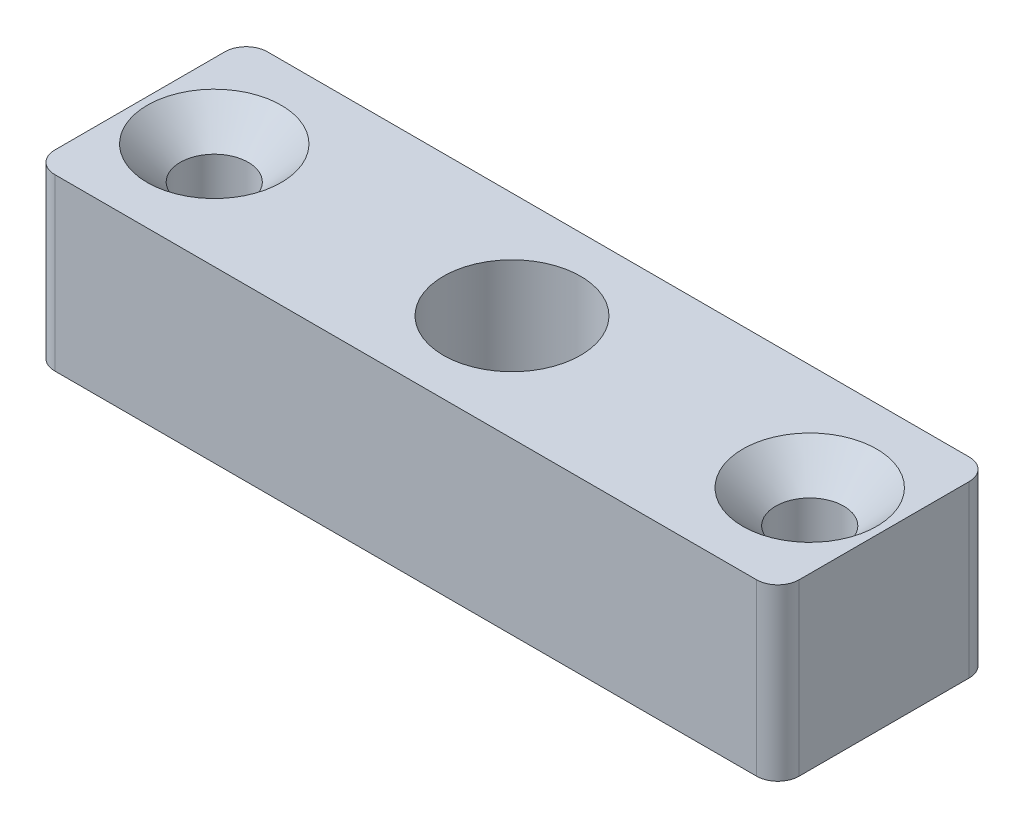
ISO-10303-21;
HEADER;
FILE_DESCRIPTION(('STEP AP214'),'2;1');
FILE_NAME('part.step','',(''),(''),'','','');
FILE_SCHEMA(('AUTOMOTIVE_DESIGN { 1 0 10303 214 1 1 1 1 }'));
ENDSEC;
DATA;
#1=APPLICATION_CONTEXT('core data for automotive mechanical design processes');
#2=APPLICATION_PROTOCOL_DEFINITION('international standard','automotive_design',2000,#1);
#3=PRODUCT_CONTEXT('',#1,'mechanical');
#4=PRODUCT('Part','Part','',(#3));
#5=PRODUCT_RELATED_PRODUCT_CATEGORY('part','',(#4));
#6=PRODUCT_DEFINITION_FORMATION('','',#4);
#7=PRODUCT_DEFINITION_CONTEXT('part definition',#1,'design');
#8=PRODUCT_DEFINITION('design','',#6,#7);
#9=PRODUCT_DEFINITION_SHAPE('','',#8);
#10=(LENGTH_UNIT() NAMED_UNIT(*) SI_UNIT(.MILLI.,.METRE.));
#11=(NAMED_UNIT(*) PLANE_ANGLE_UNIT() SI_UNIT($,.RADIAN.));
#12=(NAMED_UNIT(*) SI_UNIT($,.STERADIAN.) SOLID_ANGLE_UNIT());
#13=UNCERTAINTY_MEASURE_WITH_UNIT(LENGTH_MEASURE(1.E-05),#10,'distance_accuracy_value','');
#14=(GEOMETRIC_REPRESENTATION_CONTEXT(3) GLOBAL_UNCERTAINTY_ASSIGNED_CONTEXT((#13)) GLOBAL_UNIT_ASSIGNED_CONTEXT((#10,
#11,#12)) REPRESENTATION_CONTEXT('',''));
#15=CARTESIAN_POINT('',(0.,0.,0.));
#16=DIRECTION('',(0.,0.,1.));
#17=DIRECTION('',(1.,0.,0.));
#18=AXIS2_PLACEMENT_3D('',#15,#16,#17);
#19=CARTESIAN_POINT('',(-17.5,-8.,-5.));
#20=DIRECTION('',(-1.,0.,0.));
#21=DIRECTION('',(0.,0.,1.));
#22=AXIS2_PLACEMENT_3D('',#19,#20,#21);
#23=PLANE('',#22);
#24=DIRECTION('',(0.,0.,1.));
#25=VECTOR('',#24,1.);
#26=CARTESIAN_POINT('',(-17.5,0.,-5.));
#27=LINE('',#26,#25);
#28=CARTESIAN_POINT('',(-17.5,0.,-4.));
#29=VERTEX_POINT('',#28);
#30=CARTESIAN_POINT('',(-17.5,0.,4.));
#31=VERTEX_POINT('',#30);
#32=EDGE_CURVE('E143',#29,#31,#27,.T.);
#33=ORIENTED_EDGE('',*,*,#32,.F.);
#34=DIRECTION('',(0.,1.,0.));
#35=VECTOR('',#34,1.);
#36=CARTESIAN_POINT('',(-17.5,-8.,-4.));
#37=LINE('',#36,#35);
#38=CARTESIAN_POINT('',(-17.5,-8.,-4.));
#39=VERTEX_POINT('',#38);
#40=EDGE_CURVE('E11',#29,#39,#37,.F.);
#41=ORIENTED_EDGE('',*,*,#40,.T.);
#42=DIRECTION('',(0.,0.,1.));
#43=VECTOR('',#42,1.);
#44=CARTESIAN_POINT('',(-17.5,-8.,-5.));
#45=LINE('',#44,#43);
#46=CARTESIAN_POINT('',(-17.5,-8.,4.));
#47=VERTEX_POINT('',#46);
#48=EDGE_CURVE('E141',#39,#47,#45,.T.);
#49=ORIENTED_EDGE('',*,*,#48,.T.);
#50=DIRECTION('',(0.,1.,0.));
#51=VECTOR('',#50,1.);
#52=CARTESIAN_POINT('',(-17.5,-8.,4.));
#53=LINE('',#52,#51);
#54=EDGE_CURVE('E50',#47,#31,#53,.T.);
#55=ORIENTED_EDGE('',*,*,#54,.T.);
#56=EDGE_LOOP('',(#33,#41,#49,#55));
#57=FACE_BOUND('',#56,.T.);
#58=ADVANCED_FACE('F41',(#57),#23,.T.);
#59=CARTESIAN_POINT('',(-17.5,-8.,-5.));
#60=DIRECTION('',(0.,0.,1.));
#61=DIRECTION('',(1.,0.,0.));
#62=AXIS2_PLACEMENT_3D('',#59,#60,#61);
#63=PLANE('',#62);
#64=DIRECTION('',(1.,0.,0.));
#65=VECTOR('',#64,1.);
#66=CARTESIAN_POINT('',(-17.5,0.,-5.));
#67=LINE('',#66,#65);
#68=CARTESIAN_POINT('',(-16.5,0.,-5.));
#69=VERTEX_POINT('',#68);
#70=CARTESIAN_POINT('',(16.5,0.,-5.));
#71=VERTEX_POINT('',#70);
#72=EDGE_CURVE('E136',#69,#71,#67,.T.);
#73=ORIENTED_EDGE('',*,*,#72,.T.);
#74=DIRECTION('',(0.,1.,0.));
#75=VECTOR('',#74,1.);
#76=CARTESIAN_POINT('',(16.5,-8.,-5.));
#77=LINE('',#76,#75);
#78=CARTESIAN_POINT('',(16.5,-8.,-5.));
#79=VERTEX_POINT('',#78);
#80=EDGE_CURVE('E113',#71,#79,#77,.F.);
#81=ORIENTED_EDGE('',*,*,#80,.T.);
#82=DIRECTION('',(1.,0.,0.));
#83=VECTOR('',#82,1.);
#84=CARTESIAN_POINT('',(-17.5,-8.,-5.));
#85=LINE('',#84,#83);
#86=CARTESIAN_POINT('',(-16.5,-8.,-5.));
#87=VERTEX_POINT('',#86);
#88=EDGE_CURVE('E148',#87,#79,#85,.T.);
#89=ORIENTED_EDGE('',*,*,#88,.F.);
#90=DIRECTION('',(0.,1.,0.));
#91=VECTOR('',#90,1.);
#92=CARTESIAN_POINT('',(-16.5,0.,-5.));
#93=LINE('',#92,#91);
#94=EDGE_CURVE('E119',#87,#69,#93,.T.);
#95=ORIENTED_EDGE('',*,*,#94,.T.);
#96=EDGE_LOOP('',(#73,#81,#89,#95));
#97=FACE_BOUND('',#96,.T.);
#98=ADVANCED_FACE('F267',(#97),#63,.F.);
#99=CARTESIAN_POINT('',(17.5,-8.,-5.));
#100=DIRECTION('',(-1.,0.,0.));
#101=DIRECTION('',(0.,0.,1.));
#102=AXIS2_PLACEMENT_3D('',#99,#100,#101);
#103=PLANE('',#102);
#104=DIRECTION('',(0.,0.,1.));
#105=VECTOR('',#104,1.);
#106=CARTESIAN_POINT('',(17.5,-8.,-5.));
#107=LINE('',#106,#105);
#108=CARTESIAN_POINT('',(17.5,-8.,-4.));
#109=VERTEX_POINT('',#108);
#110=CARTESIAN_POINT('',(17.5,-8.,4.));
#111=VERTEX_POINT('',#110);
#112=EDGE_CURVE('E128',#109,#111,#107,.T.);
#113=ORIENTED_EDGE('',*,*,#112,.F.);
#114=DIRECTION('',(0.,1.,0.));
#115=VECTOR('',#114,1.);
#116=CARTESIAN_POINT('',(17.5,-8.,-4.));
#117=LINE('',#116,#115);
#118=CARTESIAN_POINT('',(17.5,0.,-4.));
#119=VERTEX_POINT('',#118);
#120=EDGE_CURVE('E112',#109,#119,#117,.T.);
#121=ORIENTED_EDGE('',*,*,#120,.T.);
#122=DIRECTION('',(0.,0.,1.));
#123=VECTOR('',#122,1.);
#124=CARTESIAN_POINT('',(17.5,0.,-5.));
#125=LINE('',#124,#123);
#126=CARTESIAN_POINT('',(17.5,0.,4.));
#127=VERTEX_POINT('',#126);
#128=EDGE_CURVE('E126',#119,#127,#125,.T.);
#129=ORIENTED_EDGE('',*,*,#128,.T.);
#130=DIRECTION('',(0.,1.,0.));
#131=VECTOR('',#130,1.);
#132=CARTESIAN_POINT('',(17.5,-8.,4.));
#133=LINE('',#132,#131);
#134=EDGE_CURVE('E131',#127,#111,#133,.F.);
#135=ORIENTED_EDGE('',*,*,#134,.T.);
#136=EDGE_LOOP('',(#113,#121,#129,#135));
#137=FACE_BOUND('',#136,.T.);
#138=ADVANCED_FACE('F125',(#137),#103,.F.);
#139=CARTESIAN_POINT('',(-17.5,-8.,5.));
#140=DIRECTION('',(0.,0.,1.));
#141=DIRECTION('',(1.,0.,0.));
#142=AXIS2_PLACEMENT_3D('',#139,#140,#141);
#143=PLANE('',#142);
#144=DIRECTION('',(1.,0.,0.));
#145=VECTOR('',#144,1.);
#146=CARTESIAN_POINT('',(-17.5,-8.,5.));
#147=LINE('',#146,#145);
#148=CARTESIAN_POINT('',(-16.5,-8.,5.));
#149=VERTEX_POINT('',#148);
#150=CARTESIAN_POINT('',(16.5,-8.,5.));
#151=VERTEX_POINT('',#150);
#152=EDGE_CURVE('E201',#149,#151,#147,.T.);
#153=ORIENTED_EDGE('',*,*,#152,.T.);
#154=DIRECTION('',(0.,1.,0.));
#155=VECTOR('',#154,1.);
#156=CARTESIAN_POINT('',(16.5,0.,5.));
#157=LINE('',#156,#155);
#158=CARTESIAN_POINT('',(16.5,0.,5.));
#159=VERTEX_POINT('',#158);
#160=EDGE_CURVE('E175',#151,#159,#157,.T.);
#161=ORIENTED_EDGE('',*,*,#160,.T.);
#162=DIRECTION('',(1.,0.,0.));
#163=VECTOR('',#162,1.);
#164=CARTESIAN_POINT('',(-17.5,0.,5.));
#165=LINE('',#164,#163);
#166=CARTESIAN_POINT('',(-16.5,0.,5.));
#167=VERTEX_POINT('',#166);
#168=EDGE_CURVE('E137',#167,#159,#165,.T.);
#169=ORIENTED_EDGE('',*,*,#168,.F.);
#170=DIRECTION('',(0.,1.,0.));
#171=VECTOR('',#170,1.);
#172=CARTESIAN_POINT('',(-16.5,-8.,5.));
#173=LINE('',#172,#171);
#174=EDGE_CURVE('E64',#167,#149,#173,.F.);
#175=ORIENTED_EDGE('',*,*,#174,.T.);
#176=EDGE_LOOP('',(#153,#161,#169,#175));
#177=FACE_BOUND('',#176,.T.);
#178=ADVANCED_FACE('F276',(#177),#143,.T.);
#179=CARTESIAN_POINT('',(0.,-8.,0.));
#180=DIRECTION('',(0.,1.,0.));
#181=DIRECTION('',(0.,0.,1.));
#182=AXIS2_PLACEMENT_3D('',#179,#180,#181);
#183=PLANE('',#182);
#184=CARTESIAN_POINT('',(-14.,-8.,0.));
#185=DIRECTION('',(0.,1.,0.));
#186=DIRECTION('',(0.,0.,1.));
#187=AXIS2_PLACEMENT_3D('',#184,#185,#186);
#188=CIRCLE('',#187,1.6);
#189=CARTESIAN_POINT('',(-14.,-8.,1.6));
#190=VERTEX_POINT('',#189);
#191=EDGE_CURVE('E213',#190,#190,#188,.T.);
#192=ORIENTED_EDGE('',*,*,#191,.T.);
#193=EDGE_LOOP('',(#192));
#194=FACE_BOUND('',#193,.T.);
#195=CARTESIAN_POINT('',(14.,-8.,0.));
#196=DIRECTION('',(0.,1.,0.));
#197=DIRECTION('',(0.,0.,1.));
#198=AXIS2_PLACEMENT_3D('',#195,#196,#197);
#199=CIRCLE('',#198,1.6);
#200=CARTESIAN_POINT('',(14.,-8.,1.59999999999999));
#201=VERTEX_POINT('',#200);
#202=EDGE_CURVE('E190',#201,#201,#199,.T.);
#203=ORIENTED_EDGE('',*,*,#202,.T.);
#204=EDGE_LOOP('',(#203));
#205=FACE_BOUND('',#204,.T.);
#206=ORIENTED_EDGE('',*,*,#88,.T.);
#207=CARTESIAN_POINT('',(16.5,-8.,-4.));
#208=DIRECTION('',(0.,1.,0.));
#209=DIRECTION('',(0.,0.,1.));
#210=AXIS2_PLACEMENT_3D('',#207,#208,#209);
#211=CIRCLE('',#210,1.);
#212=EDGE_CURVE('E170',#79,#109,#211,.F.);
#213=ORIENTED_EDGE('',*,*,#212,.T.);
#214=ORIENTED_EDGE('',*,*,#112,.T.);
#215=CARTESIAN_POINT('',(16.5,-8.,4.));
#216=DIRECTION('',(0.,1.,0.));
#217=DIRECTION('',(0.,0.,1.));
#218=AXIS2_PLACEMENT_3D('',#215,#216,#217);
#219=CIRCLE('',#218,1.);
#220=EDGE_CURVE('E57',#111,#151,#219,.F.);
#221=ORIENTED_EDGE('',*,*,#220,.T.);
#222=ORIENTED_EDGE('',*,*,#152,.F.);
#223=CARTESIAN_POINT('',(-16.5,-8.,4.));
#224=DIRECTION('',(0.,1.,0.));
#225=DIRECTION('',(0.,0.,1.));
#226=AXIS2_PLACEMENT_3D('',#223,#224,#225);
#227=CIRCLE('',#226,1.);
#228=EDGE_CURVE('E162',#149,#47,#227,.F.);
#229=ORIENTED_EDGE('',*,*,#228,.T.);
#230=ORIENTED_EDGE('',*,*,#48,.F.);
#231=CARTESIAN_POINT('',(-16.5,-8.,-4.));
#232=DIRECTION('',(0.,1.,0.));
#233=DIRECTION('',(0.,0.,1.));
#234=AXIS2_PLACEMENT_3D('',#231,#232,#233);
#235=CIRCLE('',#234,1.);
#236=EDGE_CURVE('E165',#39,#87,#235,.F.);
#237=ORIENTED_EDGE('',*,*,#236,.T.);
#238=EDGE_LOOP('',(#206,#213,#214,#221,#222,#229,#230,#237));
#239=FACE_BOUND('',#238,.T.);
#240=ADVANCED_FACE('F246',(#194,#205,#239),#183,.F.);
#241=CARTESIAN_POINT('',(0.,0.,0.));
#242=DIRECTION('',(0.,1.,0.));
#243=DIRECTION('',(0.,0.,1.));
#244=AXIS2_PLACEMENT_3D('',#241,#242,#243);
#245=PLANE('',#244);
#246=CARTESIAN_POINT('',(0.,0.,0.));
#247=DIRECTION('',(0.,1.,0.));
#248=DIRECTION('',(0.,0.,1.));
#249=AXIS2_PLACEMENT_3D('',#246,#247,#248);
#250=CIRCLE('',#249,3.225);
#251=CARTESIAN_POINT('',(0.,0.,3.225));
#252=VERTEX_POINT('',#251);
#253=EDGE_CURVE('E226',#252,#252,#250,.T.);
#254=ORIENTED_EDGE('',*,*,#253,.F.);
#255=EDGE_LOOP('',(#254));
#256=FACE_BOUND('',#255,.T.);
#257=CARTESIAN_POINT('',(-14.,0.,0.));
#258=DIRECTION('',(0.,1.,0.));
#259=DIRECTION('',(0.,0.,1.));
#260=AXIS2_PLACEMENT_3D('',#257,#258,#259);
#261=CIRCLE('',#260,3.15);
#262=CARTESIAN_POINT('',(-14.,0.,3.15));
#263=VERTEX_POINT('',#262);
#264=EDGE_CURVE('E221',#263,#263,#261,.T.);
#265=ORIENTED_EDGE('',*,*,#264,.F.);
#266=EDGE_LOOP('',(#265));
#267=FACE_BOUND('',#266,.T.);
#268=CARTESIAN_POINT('',(14.,0.,0.));
#269=DIRECTION('',(0.,1.,0.));
#270=DIRECTION('',(0.,0.,1.));
#271=AXIS2_PLACEMENT_3D('',#268,#269,#270);
#272=CIRCLE('',#271,3.15);
#273=CARTESIAN_POINT('',(14.,0.,3.14999999999999));
#274=VERTEX_POINT('',#273);
#275=EDGE_CURVE('E209',#274,#274,#272,.T.);
#276=ORIENTED_EDGE('',*,*,#275,.F.);
#277=EDGE_LOOP('',(#276));
#278=FACE_BOUND('',#277,.T.);
#279=ORIENTED_EDGE('',*,*,#128,.F.);
#280=CARTESIAN_POINT('',(16.5,0.,-4.));
#281=DIRECTION('',(0.,1.,0.));
#282=DIRECTION('',(0.,0.,1.));
#283=AXIS2_PLACEMENT_3D('',#280,#281,#282);
#284=CIRCLE('',#283,1.);
#285=EDGE_CURVE('E108',#119,#71,#284,.T.);
#286=ORIENTED_EDGE('',*,*,#285,.T.);
#287=ORIENTED_EDGE('',*,*,#72,.F.);
#288=CARTESIAN_POINT('',(-16.5,0.,-4.));
#289=DIRECTION('',(0.,1.,0.));
#290=DIRECTION('',(0.,0.,1.));
#291=AXIS2_PLACEMENT_3D('',#288,#289,#290);
#292=CIRCLE('',#291,1.);
#293=EDGE_CURVE('E152',#69,#29,#292,.T.);
#294=ORIENTED_EDGE('',*,*,#293,.T.);
#295=ORIENTED_EDGE('',*,*,#32,.T.);
#296=CARTESIAN_POINT('',(-16.5,0.,4.));
#297=DIRECTION('',(0.,1.,0.));
#298=DIRECTION('',(0.,0.,1.));
#299=AXIS2_PLACEMENT_3D('',#296,#297,#298);
#300=CIRCLE('',#299,1.);
#301=EDGE_CURVE('E130',#31,#167,#300,.T.);
#302=ORIENTED_EDGE('',*,*,#301,.T.);
#303=ORIENTED_EDGE('',*,*,#168,.T.);
#304=CARTESIAN_POINT('',(16.5,0.,4.));
#305=DIRECTION('',(0.,1.,0.));
#306=DIRECTION('',(0.,0.,1.));
#307=AXIS2_PLACEMENT_3D('',#304,#305,#306);
#308=CIRCLE('',#307,1.);
#309=EDGE_CURVE('E120',#159,#127,#308,.T.);
#310=ORIENTED_EDGE('',*,*,#309,.T.);
#311=EDGE_LOOP('',(#279,#286,#287,#294,#295,#302,#303,#310));
#312=FACE_BOUND('',#311,.T.);
#313=ADVANCED_FACE('F133',(#256,#267,#278,#312),#245,.T.);
#314=CARTESIAN_POINT('',(14.,0.,0.));
#315=DIRECTION('',(0.,1.,0.));
#316=DIRECTION('',(0.,0.,1.));
#317=AXIS2_PLACEMENT_3D('',#314,#315,#316);
#318=CYLINDRICAL_SURFACE('',#317,1.59999999999999);
#319=ORIENTED_EDGE('',*,*,#202,.F.);
#320=EDGE_LOOP('',(#319));
#321=FACE_BOUND('',#320,.T.);
#322=CARTESIAN_POINT('',(14.,-1.55,0.));
#323=DIRECTION('',(0.,1.,0.));
#324=DIRECTION('',(0.,0.,1.));
#325=AXIS2_PLACEMENT_3D('',#322,#323,#324);
#326=CIRCLE('',#325,1.59999999999999);
#327=CARTESIAN_POINT('',(14.,-1.55,1.59999999999998));
#328=VERTEX_POINT('',#327);
#329=EDGE_CURVE('E193',#328,#328,#326,.T.);
#330=ORIENTED_EDGE('',*,*,#329,.T.);
#331=EDGE_LOOP('',(#330));
#332=FACE_BOUND('',#331,.T.);
#333=ADVANCED_FACE('F245',(#321,#332),#318,.F.);
#334=CARTESIAN_POINT('',(14.,0.,0.));
#335=DIRECTION('',(0.,1.,0.));
#336=DIRECTION('',(0.,0.,1.));
#337=AXIS2_PLACEMENT_3D('',#334,#335,#336);
#338=CONICAL_SURFACE('',#337,3.15,0.785398163397453);
#339=ORIENTED_EDGE('',*,*,#329,.F.);
#340=EDGE_LOOP('',(#339));
#341=FACE_BOUND('',#340,.T.);
#342=ORIENTED_EDGE('',*,*,#275,.T.);
#343=EDGE_LOOP('',(#342));
#344=FACE_BOUND('',#343,.T.);
#345=ADVANCED_FACE('F252',(#341,#344),#338,.F.);
#346=CARTESIAN_POINT('',(-14.,0.,0.));
#347=DIRECTION('',(0.,1.,0.));
#348=DIRECTION('',(0.,0.,1.));
#349=AXIS2_PLACEMENT_3D('',#346,#347,#348);
#350=CYLINDRICAL_SURFACE('',#349,1.59999999999999);
#351=ORIENTED_EDGE('',*,*,#191,.F.);
#352=EDGE_LOOP('',(#351));
#353=FACE_BOUND('',#352,.T.);
#354=CARTESIAN_POINT('',(-14.,-1.55,0.));
#355=DIRECTION('',(0.,1.,0.));
#356=DIRECTION('',(0.,0.,1.));
#357=AXIS2_PLACEMENT_3D('',#354,#355,#356);
#358=CIRCLE('',#357,1.59999999999999);
#359=CARTESIAN_POINT('',(-14.,-1.55,1.59999999999999));
#360=VERTEX_POINT('',#359);
#361=EDGE_CURVE('E217',#360,#360,#358,.T.);
#362=ORIENTED_EDGE('',*,*,#361,.T.);
#363=EDGE_LOOP('',(#362));
#364=FACE_BOUND('',#363,.T.);
#365=ADVANCED_FACE('F254',(#353,#364),#350,.F.);
#366=CARTESIAN_POINT('',(-14.,0.,0.));
#367=DIRECTION('',(0.,1.,0.));
#368=DIRECTION('',(0.,0.,1.));
#369=AXIS2_PLACEMENT_3D('',#366,#367,#368);
#370=CONICAL_SURFACE('',#369,3.15,0.785398163397453);
#371=ORIENTED_EDGE('',*,*,#361,.F.);
#372=EDGE_LOOP('',(#371));
#373=FACE_BOUND('',#372,.T.);
#374=ORIENTED_EDGE('',*,*,#264,.T.);
#375=EDGE_LOOP('',(#374));
#376=FACE_BOUND('',#375,.T.);
#377=ADVANCED_FACE('F239',(#373,#376),#370,.F.);
#378=CARTESIAN_POINT('',(0.,-6.35,0.));
#379=DIRECTION('',(0.,1.,0.));
#380=DIRECTION('',(0.,0.,1.));
#381=AXIS2_PLACEMENT_3D('',#378,#379,#380);
#382=CYLINDRICAL_SURFACE('',#381,3.225);
#383=CARTESIAN_POINT('',(0.,-6.35,0.));
#384=DIRECTION('',(0.,1.,0.));
#385=DIRECTION('',(0.,0.,1.));
#386=AXIS2_PLACEMENT_3D('',#383,#384,#385);
#387=CIRCLE('',#386,3.225);
#388=CARTESIAN_POINT('',(0.,-6.35,3.225));
#389=VERTEX_POINT('',#388);
#390=EDGE_CURVE('E225',#389,#389,#387,.T.);
#391=ORIENTED_EDGE('',*,*,#390,.F.);
#392=EDGE_LOOP('',(#391));
#393=FACE_BOUND('',#392,.T.);
#394=ORIENTED_EDGE('',*,*,#253,.T.);
#395=EDGE_LOOP('',(#394));
#396=FACE_BOUND('',#395,.T.);
#397=ADVANCED_FACE('F236',(#393,#396),#382,.F.);
#398=CARTESIAN_POINT('',(0.,-6.35,0.));
#399=DIRECTION('',(0.,1.,0.));
#400=DIRECTION('',(0.,0.,1.));
#401=AXIS2_PLACEMENT_3D('',#398,#399,#400);
#402=PLANE('',#401);
#403=ORIENTED_EDGE('',*,*,#390,.T.);
#404=EDGE_LOOP('',(#403));
#405=FACE_BOUND('',#404,.T.);
#406=ADVANCED_FACE('F234',(#405),#402,.T.);
#407=CARTESIAN_POINT('',(16.5,-8.,-4.));
#408=DIRECTION('',(0.,1.,0.));
#409=DIRECTION('',(0.,0.,1.));
#410=AXIS2_PLACEMENT_3D('',#407,#408,#409);
#411=CYLINDRICAL_SURFACE('',#410,1.);
#412=ORIENTED_EDGE('',*,*,#212,.F.);
#413=ORIENTED_EDGE('',*,*,#80,.F.);
#414=ORIENTED_EDGE('',*,*,#285,.F.);
#415=ORIENTED_EDGE('',*,*,#120,.F.);
#416=EDGE_LOOP('',(#412,#413,#414,#415));
#417=FACE_BOUND('',#416,.T.);
#418=ADVANCED_FACE('F111',(#417),#411,.T.);
#419=CARTESIAN_POINT('',(16.5,-8.,4.));
#420=DIRECTION('',(0.,-1.,0.));
#421=DIRECTION('',(0.,0.,-1.));
#422=AXIS2_PLACEMENT_3D('',#419,#420,#421);
#423=CYLINDRICAL_SURFACE('',#422,1.);
#424=ORIENTED_EDGE('',*,*,#220,.F.);
#425=ORIENTED_EDGE('',*,*,#134,.F.);
#426=ORIENTED_EDGE('',*,*,#309,.F.);
#427=ORIENTED_EDGE('',*,*,#160,.F.);
#428=EDGE_LOOP('',(#424,#425,#426,#427));
#429=FACE_BOUND('',#428,.T.);
#430=ADVANCED_FACE('F280',(#429),#423,.T.);
#431=CARTESIAN_POINT('',(-16.5,-8.,-4.));
#432=DIRECTION('',(0.,-1.,0.));
#433=DIRECTION('',(0.,0.,-1.));
#434=AXIS2_PLACEMENT_3D('',#431,#432,#433);
#435=CYLINDRICAL_SURFACE('',#434,1.);
#436=ORIENTED_EDGE('',*,*,#236,.F.);
#437=ORIENTED_EDGE('',*,*,#40,.F.);
#438=ORIENTED_EDGE('',*,*,#293,.F.);
#439=ORIENTED_EDGE('',*,*,#94,.F.);
#440=EDGE_LOOP('',(#436,#437,#438,#439));
#441=FACE_BOUND('',#440,.T.);
#442=ADVANCED_FACE('F282',(#441),#435,.T.);
#443=CARTESIAN_POINT('',(-16.5,-8.,4.));
#444=DIRECTION('',(0.,1.,0.));
#445=DIRECTION('',(0.,0.,1.));
#446=AXIS2_PLACEMENT_3D('',#443,#444,#445);
#447=CYLINDRICAL_SURFACE('',#446,1.);
#448=ORIENTED_EDGE('',*,*,#228,.F.);
#449=ORIENTED_EDGE('',*,*,#174,.F.);
#450=ORIENTED_EDGE('',*,*,#301,.F.);
#451=ORIENTED_EDGE('',*,*,#54,.F.);
#452=EDGE_LOOP('',(#448,#449,#450,#451));
#453=FACE_BOUND('',#452,.T.);
#454=ADVANCED_FACE('F43',(#453),#447,.T.);
#455=CLOSED_SHELL('',(#58,#98,#138,#178,#240,#313,#333,#345,#365,#377,#397,#406,#418,#430,#442,#454));
#456=MANIFOLD_SOLID_BREP('B2',#455);
#457=ADVANCED_BREP_SHAPE_REPRESENTATION('',(#18,#456),#14);
#458=SHAPE_DEFINITION_REPRESENTATION(#9,#457);
ENDSEC;
END-ISO-10303-21;
